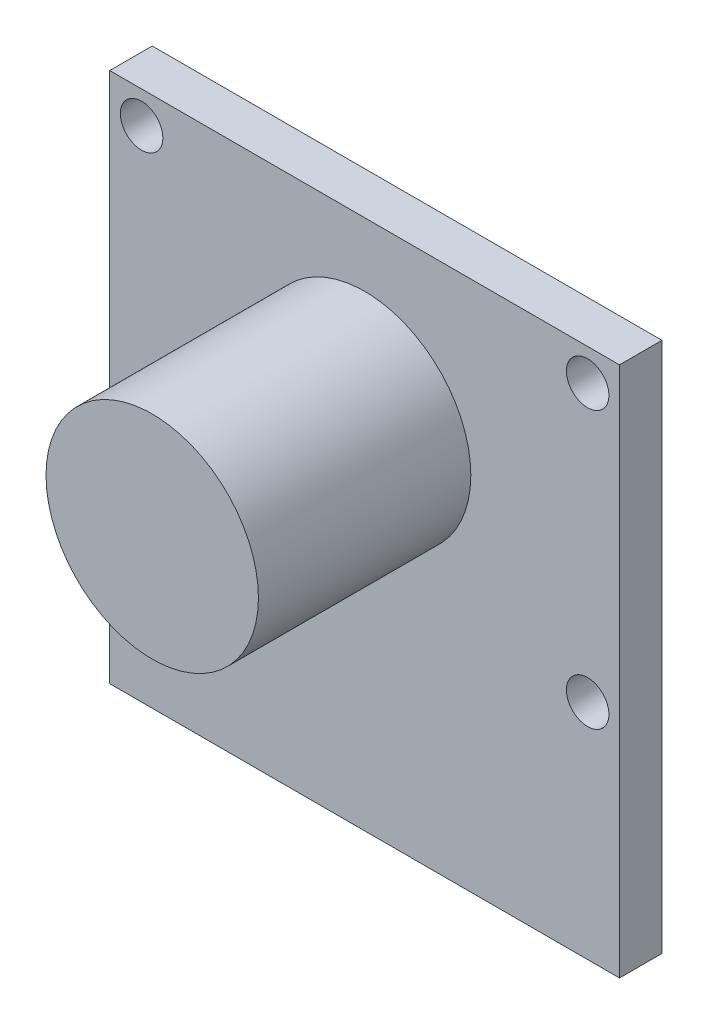
ISO-10303-21;
HEADER;
FILE_DESCRIPTION(('STEP AP214'),'2;1');
FILE_NAME('part.step','',(''),(''),'','','');
FILE_SCHEMA(('AUTOMOTIVE_DESIGN { 1 0 10303 214 1 1 1 1 }'));
ENDSEC;
DATA;
#1=APPLICATION_CONTEXT('core data for automotive mechanical design processes');
#2=APPLICATION_PROTOCOL_DEFINITION('international standard','automotive_design',2000,#1);
#3=PRODUCT_CONTEXT('',#1,'mechanical');
#4=PRODUCT('Part','Part','',(#3));
#5=PRODUCT_RELATED_PRODUCT_CATEGORY('part','',(#4));
#6=PRODUCT_DEFINITION_FORMATION('','',#4);
#7=PRODUCT_DEFINITION_CONTEXT('part definition',#1,'design');
#8=PRODUCT_DEFINITION('design','',#6,#7);
#9=PRODUCT_DEFINITION_SHAPE('','',#8);
#10=(LENGTH_UNIT() NAMED_UNIT(*) SI_UNIT(.MILLI.,.METRE.));
#11=(NAMED_UNIT(*) PLANE_ANGLE_UNIT() SI_UNIT($,.RADIAN.));
#12=(NAMED_UNIT(*) SI_UNIT($,.STERADIAN.) SOLID_ANGLE_UNIT());
#13=UNCERTAINTY_MEASURE_WITH_UNIT(LENGTH_MEASURE(1.E-05),#10,'distance_accuracy_value','');
#14=(GEOMETRIC_REPRESENTATION_CONTEXT(3) GLOBAL_UNCERTAINTY_ASSIGNED_CONTEXT((#13)) GLOBAL_UNIT_ASSIGNED_CONTEXT((#10,
#11,#12)) REPRESENTATION_CONTEXT('',''));
#15=CARTESIAN_POINT('',(0.,0.,0.));
#16=DIRECTION('',(0.,0.,1.));
#17=DIRECTION('',(1.,0.,0.));
#18=AXIS2_PLACEMENT_3D('',#15,#16,#17);
#19=CARTESIAN_POINT('',(0.,0.,2.));
#20=DIRECTION('',(0.,0.,1.));
#21=DIRECTION('',(1.,0.,0.));
#22=AXIS2_PLACEMENT_3D('',#19,#20,#21);
#23=PLANE('',#22);
#24=CARTESIAN_POINT('',(-12.,17.,2.));
#25=DIRECTION('',(0.,0.,1.));
#26=DIRECTION('',(1.,0.,0.));
#27=AXIS2_PLACEMENT_3D('',#24,#25,#26);
#28=CIRCLE('',#27,5.);
#29=CARTESIAN_POINT('',(-7.,17.,2.));
#30=VERTEX_POINT('',#29);
#31=EDGE_CURVE('E167',#30,#30,#28,.T.);
#32=ORIENTED_EDGE('',*,*,#31,.F.);
#33=EDGE_LOOP('',(#32));
#34=FACE_BOUND('',#33,.T.);
#35=CARTESIAN_POINT('',(-1.49999999999999,10.5,2.));
#36=DIRECTION('',(0.,0.,1.));
#37=DIRECTION('',(1.,0.,0.));
#38=AXIS2_PLACEMENT_3D('',#35,#36,#37);
#39=CIRCLE('',#38,1.);
#40=CARTESIAN_POINT('',(-0.499999999999994,10.5,2.));
#41=VERTEX_POINT('',#40);
#42=EDGE_CURVE('E147',#41,#41,#39,.T.);
#43=ORIENTED_EDGE('',*,*,#42,.F.);
#44=EDGE_LOOP('',(#43));
#45=FACE_BOUND('',#44,.T.);
#46=CARTESIAN_POINT('',(-22.5,23.5,2.));
#47=DIRECTION('',(0.,0.,1.));
#48=DIRECTION('',(1.,0.,0.));
#49=AXIS2_PLACEMENT_3D('',#46,#47,#48);
#50=CIRCLE('',#49,1.);
#51=CARTESIAN_POINT('',(-21.5,23.5,2.));
#52=VERTEX_POINT('',#51);
#53=EDGE_CURVE('E117',#52,#52,#50,.T.);
#54=ORIENTED_EDGE('',*,*,#53,.F.);
#55=EDGE_LOOP('',(#54));
#56=FACE_BOUND('',#55,.T.);
#57=DIRECTION('',(0.,1.,0.));
#58=VECTOR('',#57,1.);
#59=CARTESIAN_POINT('',(0.,0.,2.));
#60=LINE('',#59,#58);
#61=CARTESIAN_POINT('',(0.,0.,2.));
#62=VERTEX_POINT('',#61);
#63=CARTESIAN_POINT('',(0.,25.,2.));
#64=VERTEX_POINT('',#63);
#65=EDGE_CURVE('E97',#62,#64,#60,.T.);
#66=ORIENTED_EDGE('',*,*,#65,.T.);
#67=DIRECTION('',(-1.,0.,0.));
#68=VECTOR('',#67,1.);
#69=CARTESIAN_POINT('',(0.,25.,2.));
#70=LINE('',#69,#68);
#71=CARTESIAN_POINT('',(-24.,25.,2.));
#72=VERTEX_POINT('',#71);
#73=EDGE_CURVE('E92',#64,#72,#70,.T.);
#74=ORIENTED_EDGE('',*,*,#73,.T.);
#75=DIRECTION('',(0.,-1.,0.));
#76=VECTOR('',#75,1.);
#77=CARTESIAN_POINT('',(-24.,0.,2.));
#78=LINE('',#77,#76);
#79=CARTESIAN_POINT('',(-24.,0.,2.));
#80=VERTEX_POINT('',#79);
#81=EDGE_CURVE('E95',#72,#80,#78,.T.);
#82=ORIENTED_EDGE('',*,*,#81,.T.);
#83=DIRECTION('',(1.,0.,0.));
#84=VECTOR('',#83,1.);
#85=CARTESIAN_POINT('',(0.,0.,2.));
#86=LINE('',#85,#84);
#87=EDGE_CURVE('E62',#80,#62,#86,.T.);
#88=ORIENTED_EDGE('',*,*,#87,.T.);
#89=EDGE_LOOP('',(#66,#74,#82,#88));
#90=FACE_BOUND('',#89,.T.);
#91=CARTESIAN_POINT('',(-22.5,10.5,2.));
#92=DIRECTION('',(0.,0.,1.));
#93=DIRECTION('',(1.,0.,0.));
#94=AXIS2_PLACEMENT_3D('',#91,#92,#93);
#95=CIRCLE('',#94,1.);
#96=CARTESIAN_POINT('',(-21.5,10.5,2.));
#97=VERTEX_POINT('',#96);
#98=EDGE_CURVE('E139',#97,#97,#95,.T.);
#99=ORIENTED_EDGE('',*,*,#98,.F.);
#100=EDGE_LOOP('',(#99));
#101=FACE_BOUND('',#100,.T.);
#102=CARTESIAN_POINT('',(-1.5,23.5,2.));
#103=DIRECTION('',(0.,0.,1.));
#104=DIRECTION('',(1.,0.,0.));
#105=AXIS2_PLACEMENT_3D('',#102,#103,#104);
#106=CIRCLE('',#105,1.);
#107=CARTESIAN_POINT('',(-0.499999999999996,23.5,2.));
#108=VERTEX_POINT('',#107);
#109=EDGE_CURVE('E155',#108,#108,#106,.T.);
#110=ORIENTED_EDGE('',*,*,#109,.F.);
#111=EDGE_LOOP('',(#110));
#112=FACE_BOUND('',#111,.T.);
#113=ADVANCED_FACE('F44',(#34,#45,#56,#90,#101,#112),#23,.T.);
#114=CARTESIAN_POINT('',(0.,0.,0.));
#115=DIRECTION('',(0.,0.,1.));
#116=DIRECTION('',(1.,0.,0.));
#117=AXIS2_PLACEMENT_3D('',#114,#115,#116);
#118=PLANE('',#117);
#119=DIRECTION('',(0.,1.,0.));
#120=VECTOR('',#119,1.);
#121=CARTESIAN_POINT('',(0.,0.,0.));
#122=LINE('',#121,#120);
#123=CARTESIAN_POINT('',(0.,0.,0.));
#124=VERTEX_POINT('',#123);
#125=CARTESIAN_POINT('',(0.,25.,0.));
#126=VERTEX_POINT('',#125);
#127=EDGE_CURVE('E113',#124,#126,#122,.T.);
#128=ORIENTED_EDGE('',*,*,#127,.F.);
#129=DIRECTION('',(1.,0.,0.));
#130=VECTOR('',#129,1.);
#131=CARTESIAN_POINT('',(0.,0.,0.));
#132=LINE('',#131,#130);
#133=CARTESIAN_POINT('',(-24.,0.,0.));
#134=VERTEX_POINT('',#133);
#135=EDGE_CURVE('E85',#134,#124,#132,.T.);
#136=ORIENTED_EDGE('',*,*,#135,.F.);
#137=DIRECTION('',(0.,-1.,0.));
#138=VECTOR('',#137,1.);
#139=CARTESIAN_POINT('',(-24.,0.,0.));
#140=LINE('',#139,#138);
#141=CARTESIAN_POINT('',(-24.,25.,0.));
#142=VERTEX_POINT('',#141);
#143=EDGE_CURVE('E79',#142,#134,#140,.T.);
#144=ORIENTED_EDGE('',*,*,#143,.F.);
#145=DIRECTION('',(-1.,0.,0.));
#146=VECTOR('',#145,1.);
#147=CARTESIAN_POINT('',(0.,25.,0.));
#148=LINE('',#147,#146);
#149=EDGE_CURVE('E102',#126,#142,#148,.T.);
#150=ORIENTED_EDGE('',*,*,#149,.F.);
#151=EDGE_LOOP('',(#128,#136,#144,#150));
#152=FACE_BOUND('',#151,.T.);
#153=CARTESIAN_POINT('',(-22.5,23.5,0.));
#154=DIRECTION('',(0.,0.,1.));
#155=DIRECTION('',(1.,0.,0.));
#156=AXIS2_PLACEMENT_3D('',#153,#154,#155);
#157=CIRCLE('',#156,1.);
#158=CARTESIAN_POINT('',(-21.5,23.5,0.));
#159=VERTEX_POINT('',#158);
#160=EDGE_CURVE('E135',#159,#159,#157,.T.);
#161=ORIENTED_EDGE('',*,*,#160,.T.);
#162=EDGE_LOOP('',(#161));
#163=FACE_BOUND('',#162,.T.);
#164=CARTESIAN_POINT('',(-22.5,10.5,0.));
#165=DIRECTION('',(0.,0.,1.));
#166=DIRECTION('',(1.,0.,0.));
#167=AXIS2_PLACEMENT_3D('',#164,#165,#166);
#168=CIRCLE('',#167,1.);
#169=CARTESIAN_POINT('',(-21.5,10.5,0.));
#170=VERTEX_POINT('',#169);
#171=EDGE_CURVE('E143',#170,#170,#168,.T.);
#172=ORIENTED_EDGE('',*,*,#171,.T.);
#173=EDGE_LOOP('',(#172));
#174=FACE_BOUND('',#173,.T.);
#175=CARTESIAN_POINT('',(-1.49999999999999,10.5,0.));
#176=DIRECTION('',(0.,0.,1.));
#177=DIRECTION('',(1.,0.,0.));
#178=AXIS2_PLACEMENT_3D('',#175,#176,#177);
#179=CIRCLE('',#178,1.);
#180=CARTESIAN_POINT('',(-0.499999999999994,10.5,0.));
#181=VERTEX_POINT('',#180);
#182=EDGE_CURVE('E151',#181,#181,#179,.T.);
#183=ORIENTED_EDGE('',*,*,#182,.T.);
#184=EDGE_LOOP('',(#183));
#185=FACE_BOUND('',#184,.T.);
#186=CARTESIAN_POINT('',(-1.5,23.5,0.));
#187=DIRECTION('',(0.,0.,1.));
#188=DIRECTION('',(1.,0.,0.));
#189=AXIS2_PLACEMENT_3D('',#186,#187,#188);
#190=CIRCLE('',#189,1.);
#191=CARTESIAN_POINT('',(-0.499999999999996,23.5,0.));
#192=VERTEX_POINT('',#191);
#193=EDGE_CURVE('E159',#192,#192,#190,.T.);
#194=ORIENTED_EDGE('',*,*,#193,.T.);
#195=EDGE_LOOP('',(#194));
#196=FACE_BOUND('',#195,.T.);
#197=ADVANCED_FACE('F130',(#152,#163,#174,#185,#196),#118,.F.);
#198=CARTESIAN_POINT('',(0.,0.,2.));
#199=DIRECTION('',(-1.,0.,0.));
#200=DIRECTION('',(0.,0.,1.));
#201=AXIS2_PLACEMENT_3D('',#198,#199,#200);
#202=PLANE('',#201);
#203=ORIENTED_EDGE('',*,*,#127,.T.);
#204=DIRECTION('',(0.,0.,-1.));
#205=VECTOR('',#204,1.);
#206=CARTESIAN_POINT('',(0.,25.,2.));
#207=LINE('',#206,#205);
#208=EDGE_CURVE('E11',#64,#126,#207,.T.);
#209=ORIENTED_EDGE('',*,*,#208,.F.);
#210=ORIENTED_EDGE('',*,*,#65,.F.);
#211=DIRECTION('',(0.,0.,-1.));
#212=VECTOR('',#211,1.);
#213=CARTESIAN_POINT('',(0.,0.,2.));
#214=LINE('',#213,#212);
#215=EDGE_CURVE('E109',#62,#124,#214,.T.);
#216=ORIENTED_EDGE('',*,*,#215,.T.);
#217=EDGE_LOOP('',(#203,#209,#210,#216));
#218=FACE_BOUND('',#217,.T.);
#219=ADVANCED_FACE('F46',(#218),#202,.F.);
#220=CARTESIAN_POINT('',(0.,25.,2.));
#221=DIRECTION('',(0.,-1.,0.));
#222=DIRECTION('',(1.,0.,0.));
#223=AXIS2_PLACEMENT_3D('',#220,#221,#222);
#224=PLANE('',#223);
#225=ORIENTED_EDGE('',*,*,#149,.T.);
#226=DIRECTION('',(0.,0.,-1.));
#227=VECTOR('',#226,1.);
#228=CARTESIAN_POINT('',(-24.,25.,2.));
#229=LINE('',#228,#227);
#230=EDGE_CURVE('E54',#72,#142,#229,.T.);
#231=ORIENTED_EDGE('',*,*,#230,.F.);
#232=ORIENTED_EDGE('',*,*,#73,.F.);
#233=ORIENTED_EDGE('',*,*,#208,.T.);
#234=EDGE_LOOP('',(#225,#231,#232,#233));
#235=FACE_BOUND('',#234,.T.);
#236=ADVANCED_FACE('F101',(#235),#224,.F.);
#237=CARTESIAN_POINT('',(-24.,0.,2.));
#238=DIRECTION('',(1.,0.,0.));
#239=DIRECTION('',(0.,0.,-1.));
#240=AXIS2_PLACEMENT_3D('',#237,#238,#239);
#241=PLANE('',#240);
#242=ORIENTED_EDGE('',*,*,#143,.T.);
#243=DIRECTION('',(0.,0.,-1.));
#244=VECTOR('',#243,1.);
#245=CARTESIAN_POINT('',(-24.,0.,2.));
#246=LINE('',#245,#244);
#247=EDGE_CURVE('E104',#80,#134,#246,.T.);
#248=ORIENTED_EDGE('',*,*,#247,.F.);
#249=ORIENTED_EDGE('',*,*,#81,.F.);
#250=ORIENTED_EDGE('',*,*,#230,.T.);
#251=EDGE_LOOP('',(#242,#248,#249,#250));
#252=FACE_BOUND('',#251,.T.);
#253=ADVANCED_FACE('F105',(#252),#241,.F.);
#254=CARTESIAN_POINT('',(0.,0.,2.));
#255=DIRECTION('',(0.,1.,0.));
#256=DIRECTION('',(-1.,0.,0.));
#257=AXIS2_PLACEMENT_3D('',#254,#255,#256);
#258=PLANE('',#257);
#259=ORIENTED_EDGE('',*,*,#135,.T.);
#260=ORIENTED_EDGE('',*,*,#215,.F.);
#261=ORIENTED_EDGE('',*,*,#87,.F.);
#262=ORIENTED_EDGE('',*,*,#247,.T.);
#263=EDGE_LOOP('',(#259,#260,#261,#262));
#264=FACE_BOUND('',#263,.T.);
#265=ADVANCED_FACE('F127',(#264),#258,.F.);
#266=CARTESIAN_POINT('',(-22.5,23.5,2.));
#267=DIRECTION('',(0.,0.,-1.));
#268=DIRECTION('',(-1.,0.,0.));
#269=AXIS2_PLACEMENT_3D('',#266,#267,#268);
#270=CYLINDRICAL_SURFACE('',#269,1.);
#271=ORIENTED_EDGE('',*,*,#53,.T.);
#272=EDGE_LOOP('',(#271));
#273=FACE_BOUND('',#272,.T.);
#274=ORIENTED_EDGE('',*,*,#160,.F.);
#275=EDGE_LOOP('',(#274));
#276=FACE_BOUND('',#275,.T.);
#277=ADVANCED_FACE('F191',(#273,#276),#270,.F.);
#278=CARTESIAN_POINT('',(-22.5,10.5,2.));
#279=DIRECTION('',(0.,0.,-1.));
#280=DIRECTION('',(-1.,0.,0.));
#281=AXIS2_PLACEMENT_3D('',#278,#279,#280);
#282=CYLINDRICAL_SURFACE('',#281,1.);
#283=ORIENTED_EDGE('',*,*,#98,.T.);
#284=EDGE_LOOP('',(#283));
#285=FACE_BOUND('',#284,.T.);
#286=ORIENTED_EDGE('',*,*,#171,.F.);
#287=EDGE_LOOP('',(#286));
#288=FACE_BOUND('',#287,.T.);
#289=ADVANCED_FACE('F194',(#285,#288),#282,.F.);
#290=CARTESIAN_POINT('',(-1.49999999999999,10.5,2.));
#291=DIRECTION('',(0.,0.,-1.));
#292=DIRECTION('',(-1.,0.,0.));
#293=AXIS2_PLACEMENT_3D('',#290,#291,#292);
#294=CYLINDRICAL_SURFACE('',#293,1.);
#295=ORIENTED_EDGE('',*,*,#42,.T.);
#296=EDGE_LOOP('',(#295));
#297=FACE_BOUND('',#296,.T.);
#298=ORIENTED_EDGE('',*,*,#182,.F.);
#299=EDGE_LOOP('',(#298));
#300=FACE_BOUND('',#299,.T.);
#301=ADVANCED_FACE('F207',(#297,#300),#294,.F.);
#302=CARTESIAN_POINT('',(-1.5,23.5,2.));
#303=DIRECTION('',(0.,0.,-1.));
#304=DIRECTION('',(-1.,0.,0.));
#305=AXIS2_PLACEMENT_3D('',#302,#303,#304);
#306=CYLINDRICAL_SURFACE('',#305,1.);
#307=ORIENTED_EDGE('',*,*,#109,.T.);
#308=EDGE_LOOP('',(#307));
#309=FACE_BOUND('',#308,.T.);
#310=ORIENTED_EDGE('',*,*,#193,.F.);
#311=EDGE_LOOP('',(#310));
#312=FACE_BOUND('',#311,.T.);
#313=ADVANCED_FACE('F180',(#309,#312),#306,.F.);
#314=CARTESIAN_POINT('',(-12.,17.,12.));
#315=DIRECTION('',(0.,0.,-1.));
#316=DIRECTION('',(-1.,0.,0.));
#317=AXIS2_PLACEMENT_3D('',#314,#315,#316);
#318=CYLINDRICAL_SURFACE('',#317,5.);
#319=CARTESIAN_POINT('',(-12.,17.,12.));
#320=DIRECTION('',(0.,0.,1.));
#321=DIRECTION('',(1.,0.,0.));
#322=AXIS2_PLACEMENT_3D('',#319,#320,#321);
#323=CIRCLE('',#322,5.);
#324=CARTESIAN_POINT('',(-7.,17.,12.));
#325=VERTEX_POINT('',#324);
#326=EDGE_CURVE('E163',#325,#325,#323,.T.);
#327=ORIENTED_EDGE('',*,*,#326,.F.);
#328=EDGE_LOOP('',(#327));
#329=FACE_BOUND('',#328,.T.);
#330=ORIENTED_EDGE('',*,*,#31,.T.);
#331=EDGE_LOOP('',(#330));
#332=FACE_BOUND('',#331,.T.);
#333=ADVANCED_FACE('F177',(#329,#332),#318,.T.);
#334=CARTESIAN_POINT('',(-12.,17.,12.));
#335=DIRECTION('',(0.,0.,1.));
#336=DIRECTION('',(1.,0.,0.));
#337=AXIS2_PLACEMENT_3D('',#334,#335,#336);
#338=PLANE('',#337);
#339=ORIENTED_EDGE('',*,*,#326,.T.);
#340=EDGE_LOOP('',(#339));
#341=FACE_BOUND('',#340,.T.);
#342=ADVANCED_FACE('F175',(#341),#338,.T.);
#343=CLOSED_SHELL('',(#113,#197,#219,#236,#253,#265,#277,#289,#301,#313,#333,#342));
#344=MANIFOLD_SOLID_BREP('B2',#343);
#345=ADVANCED_BREP_SHAPE_REPRESENTATION('',(#18,#344),#14);
#346=SHAPE_DEFINITION_REPRESENTATION(#9,#345);
ENDSEC;
END-ISO-10303-21;
